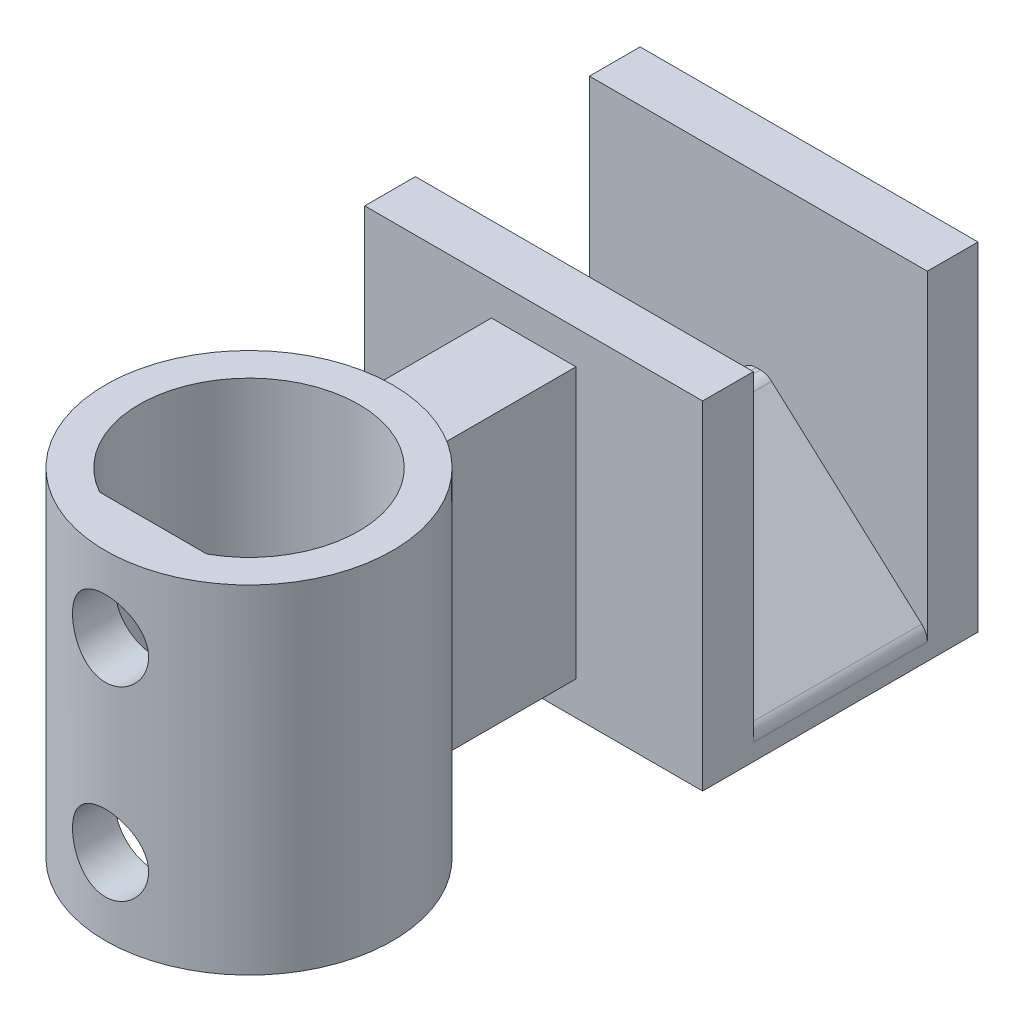
ISO-10303-21;
HEADER;
FILE_DESCRIPTION(('STEP AP214'),'2;1');
FILE_NAME('part.step','',(''),(''),'','','');
FILE_SCHEMA(('AUTOMOTIVE_DESIGN { 1 0 10303 214 1 1 1 1 }'));
ENDSEC;
DATA;
#1=APPLICATION_CONTEXT('core data for automotive mechanical design processes');
#2=APPLICATION_PROTOCOL_DEFINITION('international standard','automotive_design',2000,#1);
#3=PRODUCT_CONTEXT('',#1,'mechanical');
#4=PRODUCT('Part','Part','',(#3));
#5=PRODUCT_RELATED_PRODUCT_CATEGORY('part','',(#4));
#6=PRODUCT_DEFINITION_FORMATION('','',#4);
#7=PRODUCT_DEFINITION_CONTEXT('part definition',#1,'design');
#8=PRODUCT_DEFINITION('design','',#6,#7);
#9=PRODUCT_DEFINITION_SHAPE('','',#8);
#10=(LENGTH_UNIT() NAMED_UNIT(*) SI_UNIT(.MILLI.,.METRE.));
#11=(NAMED_UNIT(*) PLANE_ANGLE_UNIT() SI_UNIT($,.RADIAN.));
#12=(NAMED_UNIT(*) SI_UNIT($,.STERADIAN.) SOLID_ANGLE_UNIT());
#13=UNCERTAINTY_MEASURE_WITH_UNIT(LENGTH_MEASURE(1.E-05),#10,'distance_accuracy_value','');
#14=(GEOMETRIC_REPRESENTATION_CONTEXT(3) GLOBAL_UNCERTAINTY_ASSIGNED_CONTEXT((#13)) GLOBAL_UNIT_ASSIGNED_CONTEXT((#10,
#11,#12)) REPRESENTATION_CONTEXT('',''));
#15=CARTESIAN_POINT('',(0.,0.,0.));
#16=DIRECTION('',(0.,0.,1.));
#17=DIRECTION('',(1.,0.,0.));
#18=AXIS2_PLACEMENT_3D('',#15,#16,#17);
#19=CARTESIAN_POINT('',(0.,39.0416305603426,25.));
#20=DIRECTION('',(0.,-1.,0.));
#21=DIRECTION('',(0.,0.,-1.));
#22=AXIS2_PLACEMENT_3D('',#19,#20,#21);
#23=CYLINDRICAL_SURFACE('',#22,8.5);
#24=CARTESIAN_POINT('',(0.,15.,25.));
#25=DIRECTION('',(0.,-1.,0.));
#26=DIRECTION('',(0.,0.,-1.));
#27=AXIS2_PLACEMENT_3D('',#24,#25,#26);
#28=CIRCLE('',#27,8.5);
#29=CARTESIAN_POINT('',(0.,15.,16.5));
#30=VERTEX_POINT('',#29);
#31=EDGE_CURVE('E186',#30,#30,#28,.T.);
#32=ORIENTED_EDGE('',*,*,#31,.T.);
#33=EDGE_LOOP('',(#32));
#34=FACE_BOUND('',#33,.T.);
#35=CARTESIAN_POINT('',(0.,-5.,25.));
#36=DIRECTION('',(0.,1.,0.));
#37=DIRECTION('',(0.,0.,1.));
#38=AXIS2_PLACEMENT_3D('',#35,#36,#37);
#39=CIRCLE('',#38,8.5);
#40=CARTESIAN_POINT('',(0.,-5.,33.5));
#41=VERTEX_POINT('',#40);
#42=EDGE_CURVE('E192',#41,#41,#39,.F.);
#43=ORIENTED_EDGE('',*,*,#42,.F.);
#44=EDGE_LOOP('',(#43));
#45=FACE_BOUND('',#44,.T.);
#46=CARTESIAN_POINT('',(0.,-3.,25.));
#47=DIRECTION('',(0.,1.,0.));
#48=DIRECTION('',(0.,0.,1.));
#49=AXIS2_PLACEMENT_3D('',#46,#47,#48);
#50=CIRCLE('',#49,8.5);
#51=CARTESIAN_POINT('',(-2.5,-3.,16.875961595364));
#52=VERTEX_POINT('',#51);
#53=CARTESIAN_POINT('',(2.5,-3.,16.875961595364));
#54=VERTEX_POINT('',#53);
#55=EDGE_CURVE('E226',#52,#54,#50,.F.);
#56=ORIENTED_EDGE('',*,*,#55,.T.);
#57=DIRECTION('',(0.,-1.,0.));
#58=VECTOR('',#57,1.);
#59=CARTESIAN_POINT('',(2.49999999999999,39.0416305603426,16.875961595364));
#60=LINE('',#59,#58);
#61=CARTESIAN_POINT('',(2.5,13.,16.875961595364));
#62=VERTEX_POINT('',#61);
#63=EDGE_CURVE('E211',#54,#62,#60,.F.);
#64=ORIENTED_EDGE('',*,*,#63,.T.);
#65=CARTESIAN_POINT('',(0.,13.,25.));
#66=DIRECTION('',(0.,-1.,0.));
#67=DIRECTION('',(0.,0.,-1.));
#68=AXIS2_PLACEMENT_3D('',#65,#66,#67);
#69=CIRCLE('',#68,8.5);
#70=CARTESIAN_POINT('',(-2.5,13.,16.875961595364));
#71=VERTEX_POINT('',#70);
#72=EDGE_CURVE('E233',#62,#71,#69,.F.);
#73=ORIENTED_EDGE('',*,*,#72,.T.);
#74=DIRECTION('',(0.,-1.,0.));
#75=VECTOR('',#74,1.);
#76=CARTESIAN_POINT('',(-2.5,39.0416305603426,16.875961595364));
#77=LINE('',#76,#75);
#78=EDGE_CURVE('E230',#71,#52,#77,.T.);
#79=ORIENTED_EDGE('',*,*,#78,.T.);
#80=EDGE_LOOP('',(#56,#64,#73,#79));
#81=FACE_BOUND('',#80,.T.);
#82=CARTESIAN_POINT('',(-2.25,10.5,33.1967981553775));
#83=CARTESIAN_POINT('',(-2.24999694180408,10.6239840002776,33.1968003362435));
#84=CARTESIAN_POINT('',(-2.23971706610501,10.7480005412109,33.1996419584915));
#85=CARTESIAN_POINT('',(-2.198945615888,10.9924544608563,33.2106680196964));
#86=CARTESIAN_POINT('',(-2.16844370713168,11.112889976629,33.2188551904021));
#87=CARTESIAN_POINT('',(-2.0882990785985,11.3466102401079,33.2395815791112));
#88=CARTESIAN_POINT('',(-2.03868300476042,11.459904688051,33.2521147362105));
#89=CARTESIAN_POINT('',(-1.92180166354043,11.6765786826062,33.2801132198881));
#90=CARTESIAN_POINT('',(-1.85453509902009,11.7799574997535,33.2955787619447));
#91=CARTESIAN_POINT('',(-1.70248951742595,11.9764139017784,33.3281265446091));
#92=CARTESIAN_POINT('',(-1.61735395744878,12.0692109081865,33.3452371126252));
#93=CARTESIAN_POINT('',(-1.4327540142738,12.2393902103004,33.3789023677977));
#94=CARTESIAN_POINT('',(-1.33328816547564,12.3167709274061,33.3954569978831));
#95=CARTESIAN_POINT('',(-1.12090838569079,12.4550884366435,33.4264608929721));
#96=CARTESIAN_POINT('',(-1.00780712819347,12.5157466883929,33.4408728427373));
#97=CARTESIAN_POINT('',(-0.772566710508234,12.6170815196129,33.4656427357432));
#98=CARTESIAN_POINT('',(-0.650429055025734,12.6577614172222,33.4760013521304));
#99=CARTESIAN_POINT('',(-0.403511110172187,12.7170778425828,33.4912971460741));
#100=CARTESIAN_POINT('',(-0.278852839843893,12.7361915561904,33.4963515042717));
#101=CARTESIAN_POINT('',(-0.0280034780646866,12.7533339423421,33.5008788349257));
#102=CARTESIAN_POINT('',(0.0981873570184365,12.7513660941808,33.5003527283806));
#103=CARTESIAN_POINT('',(0.34519977639906,12.7267381177659,33.4938644304373));
#104=CARTESIAN_POINT('',(0.466076857336715,12.7045934898765,33.4880376721779));
#105=CARTESIAN_POINT('',(0.702334013138001,12.6410728615727,33.4717623278363));
#106=CARTESIAN_POINT('',(0.817713776487286,12.5996957727456,33.4613134801802));
#107=CARTESIAN_POINT('',(1.04102215095086,12.4984870248307,33.4367663576623));
#108=CARTESIAN_POINT('',(1.14886634833951,12.4384779194592,33.4226332115479));
#109=CARTESIAN_POINT('',(1.3531303740591,12.301844580475,33.3922415251126));
#110=CARTESIAN_POINT('',(1.44954799839656,12.2252171495074,33.375982576028));
#111=CARTESIAN_POINT('',(1.63129857081783,12.0547825542084,33.342521924539));
#112=CARTESIAN_POINT('',(1.71620777876131,11.9605256731685,33.3253065822884));
#113=CARTESIAN_POINT('',(1.86911637013184,11.7589321307718,33.2923181202052));
#114=CARTESIAN_POINT('',(1.93711475347608,11.6515946964081,33.2765450857034));
#115=CARTESIAN_POINT('',(2.05458778503724,11.4259787352489,33.2481731019722));
#116=CARTESIAN_POINT('',(2.10394886477225,11.3076384369629,33.2355937612802));
#117=CARTESIAN_POINT('',(2.18193716023719,11.0639230764637,33.2152779792318));
#118=CARTESIAN_POINT('',(2.21056943128527,10.9385497375025,33.207540357145));
#119=CARTESIAN_POINT('',(2.24556016825425,10.6882860893502,33.1980351929453));
#120=CARTESIAN_POINT('',(2.25255005779307,10.5634903897575,33.1960984643835));
#121=CARTESIAN_POINT('',(2.24579596911986,10.3145136151024,33.1979517680045));
#122=CARTESIAN_POINT('',(2.23205416085442,10.19033247708,33.2017412008412));
#123=CARTESIAN_POINT('',(2.18478304951454,9.94853203437677,33.2144565867633));
#124=CARTESIAN_POINT('',(2.15163187005439,9.83083314067768,33.2232843058655));
#125=CARTESIAN_POINT('',(2.06690749717098,9.60266578735862,33.2449859622244));
#126=CARTESIAN_POINT('',(2.0153319242454,9.49219826384843,33.2578604220901));
#127=CARTESIAN_POINT('',(1.89393612864426,9.27898360406455,33.2865532711528));
#128=CARTESIAN_POINT('',(1.82374430356199,9.17645600255329,33.3024294781708));
#129=CARTESIAN_POINT('',(1.66757023068808,8.98440278488017,33.3352002454647));
#130=CARTESIAN_POINT('',(1.58158505971235,8.89487958119961,33.3520949938724));
#131=CARTESIAN_POINT('',(1.39334723217788,8.72876291555247,33.3855805923336));
#132=CARTESIAN_POINT('',(1.29070161878611,8.65260935870141,33.4021491503459));
#133=CARTESIAN_POINT('',(1.07371678547403,8.51861464758931,33.4326221761272));
#134=CARTESIAN_POINT('',(0.959378187911347,8.46077251937521,33.4465267855714));
#135=CARTESIAN_POINT('',(0.723057226149525,8.36557056201773,33.470015772103));
#136=CARTESIAN_POINT('',(0.60113959611423,8.32805833034544,33.4796321961789));
#137=CARTESIAN_POINT('',(0.352439036803731,8.2741367860407,33.4936022569498));
#138=CARTESIAN_POINT('',(0.225657174963255,8.25772287044393,33.4979570415506));
#139=CARTESIAN_POINT('',(-0.0250604722587875,8.24674873433714,33.5008598374346));
#140=CARTESIAN_POINT('',(-0.148966409472797,8.2515427679478,33.499579436696));
#141=CARTESIAN_POINT('',(-0.394141954180563,8.28135153536109,33.4917428575153));
#142=CARTESIAN_POINT('',(-0.515411657917084,8.30636552970252,33.4851868720061));
#143=CARTESIAN_POINT('',(-0.751107699159933,8.37554121781611,33.4675689262979));
#144=CARTESIAN_POINT('',(-0.865574416324465,8.41957360028427,33.4565374265752));
#145=CARTESIAN_POINT('',(-1.08556048681217,8.5254205314973,33.4311229382255));
#146=CARTESIAN_POINT('',(-1.19107859706731,8.58723754551755,33.4167394850088));
#147=CARTESIAN_POINT('',(-1.39318530515942,8.72879850578497,33.3856885458129));
#148=CARTESIAN_POINT('',(-1.48946543719377,8.80897181418192,33.3689708718519));
#149=CARTESIAN_POINT('',(-1.66742398064291,8.98415288335479,33.3353414220771));
#150=CARTESIAN_POINT('',(-1.74909856114583,9.07916452389294,33.3184295965731));
#151=CARTESIAN_POINT('',(-1.8972708258445,9.2837921479421,33.285906991571));
#152=CARTESIAN_POINT('',(-1.96340296292341,9.39367904330234,33.2703321637851));
#153=CARTESIAN_POINT('',(-2.07615948784757,9.62341015894324,33.2427515934587));
#154=CARTESIAN_POINT('',(-2.12279681152532,9.74324771294936,33.2307434857482));
#155=CARTESIAN_POINT('',(-2.18903256232817,9.96889360228065,33.2133487458215));
#156=CARTESIAN_POINT('',(-2.21184214669942,10.0737109686333,33.2071920574266));
#157=CARTESIAN_POINT('',(-2.24232635318084,10.2856776239988,33.1989160421293));
#158=CARTESIAN_POINT('',(-2.25000264354342,10.3928266546586,33.1967962702092));
#159=CARTESIAN_POINT('',(-2.25,10.5,33.1967981553775));
#160=B_SPLINE_CURVE_WITH_KNOTS('',3,(#82,#83,#84,#85,#86,#87,#88,#89,#90,#91,#92,#93,#94,#95,
#96,#97,#98,#99,#100,#101,#102,#103,#104,#105,#106,#107,#108,#109,#110,#111,#112,#113,#114,#115,
#116,#117,#118,#119,#120,#121,#122,#123,#124,#125,#126,#127,#128,#129,#130,#131,#132,#133,#134,
#135,#136,#137,#138,#139,#140,#141,#142,#143,#144,#145,#146,#147,#148,#149,#150,#151,#152,#153,
#154,#155,#156,#157,#158,#159),.UNSPECIFIED.,.T.,.F.,(4,2,2,2,2,2,2,2,2,2,2,2,2,2,2,2,2,2,2,2,2,
2,2,2,2,2,2,2,2,2,2,2,2,2,2,2,2,2,4),(0.,0.37155797163531,0.743305970231715,1.11453760110695,
1.48579652152091,1.86532086241599,2.24488404596034,2.63043245150024,3.01591680090743,
3.39269333716487,3.76940769129443,4.13675920765004,4.50413151587257,4.87511584526133,
5.24617161521628,5.62845622010334,6.01076342740043,6.3953640456007,6.77987083621654,
7.15304843134813,7.52618696941451,7.89228731518204,8.25843495975225,8.63252754907452,
9.00668944894658,9.39148781847044,9.77626571779774,10.1581177737158,10.539886507824,
10.9101123860205,11.2803247253535,11.6480585642679,12.0158434024024,12.3933170752266,
12.7708896114263,13.156610044578,13.5420741241071,13.8632889681006,14.1844684002793),.UNSPECIFIED.);
#161=CARTESIAN_POINT('',(-2.25,10.5,33.1967981553775));
#162=VERTEX_POINT('',#161);
#163=EDGE_CURVE('E198',#162,#162,#160,.T.);
#164=ORIENTED_EDGE('',*,*,#163,.T.);
#165=EDGE_LOOP('',(#164));
#166=FACE_BOUND('',#165,.T.);
#167=CARTESIAN_POINT('',(-2.25,-0.500000000000002,33.1967981553775));
#168=CARTESIAN_POINT('',(-2.24999694180408,-0.376015999722374,33.1968003362435));
#169=CARTESIAN_POINT('',(-2.23971706610501,-0.251999458789078,33.1996419584915));
#170=CARTESIAN_POINT('',(-2.198945615888,-0.00754553914369019,33.2106680196964));
#171=CARTESIAN_POINT('',(-2.16844370713168,0.112889976628972,33.2188551904021));
#172=CARTESIAN_POINT('',(-2.0882990785985,0.346610240107896,33.2395815791112));
#173=CARTESIAN_POINT('',(-2.03868300476042,0.459904688051024,33.2521147362105));
#174=CARTESIAN_POINT('',(-1.92180166354043,0.676578682606188,33.2801132198881));
#175=CARTESIAN_POINT('',(-1.85453509902009,0.779957499753548,33.2955787619447));
#176=CARTESIAN_POINT('',(-1.70248951742595,0.976413901778359,33.3281265446091));
#177=CARTESIAN_POINT('',(-1.61735395744878,1.06921090818649,33.3452371126252));
#178=CARTESIAN_POINT('',(-1.4327540142738,1.23939021030035,33.3789023677977));
#179=CARTESIAN_POINT('',(-1.33328816547564,1.31677092740614,33.3954569978831));
#180=CARTESIAN_POINT('',(-1.12090838569079,1.45508843664353,33.426460892972));
#181=CARTESIAN_POINT('',(-1.00780712819347,1.51574668839292,33.4408728427372));
#182=CARTESIAN_POINT('',(-0.772566710508234,1.6170815196129,33.4656427357431));
#183=CARTESIAN_POINT('',(-0.650429055025735,1.65776141722221,33.4760013521304));
#184=CARTESIAN_POINT('',(-0.403511110172187,1.71707784258281,33.4912971460741));
#185=CARTESIAN_POINT('',(-0.278852839843893,1.73619155619042,33.4963515042717));
#186=CARTESIAN_POINT('',(-0.0280034780646869,1.75333394234214,33.5008788349257));
#187=CARTESIAN_POINT('',(0.0981873570184361,1.75136609418084,33.5003527283806));
#188=CARTESIAN_POINT('',(0.34519977639906,1.72673811776592,33.4938644304373));
#189=CARTESIAN_POINT('',(0.466076857336715,1.70459348987647,33.4880376721779));
#190=CARTESIAN_POINT('',(0.702334013138001,1.6410728615727,33.4717623278363));
#191=CARTESIAN_POINT('',(0.817713776487285,1.59969577274563,33.4613134801802));
#192=CARTESIAN_POINT('',(1.04102215095086,1.49848702483075,33.4367663576623));
#193=CARTESIAN_POINT('',(1.14886634833951,1.43847791945919,33.4226332115479));
#194=CARTESIAN_POINT('',(1.3531303740591,1.30184458047502,33.3922415251126));
#195=CARTESIAN_POINT('',(1.44954799839656,1.22521714950741,33.375982576028));
#196=CARTESIAN_POINT('',(1.63129857081783,1.05478255420836,33.342521924539));
#197=CARTESIAN_POINT('',(1.71620777876131,0.960525673168511,33.3253065822884));
#198=CARTESIAN_POINT('',(1.86911637013183,0.758932130771777,33.2923181202052));
#199=CARTESIAN_POINT('',(1.93711475347608,0.651594696408099,33.2765450857034));
#200=CARTESIAN_POINT('',(2.05458778503724,0.425978735248875,33.2481731019722));
#201=CARTESIAN_POINT('',(2.10394886477225,0.307638436962872,33.2355937612802));
#202=CARTESIAN_POINT('',(2.18193716023719,0.0639230764637289,33.2152779792318));
#203=CARTESIAN_POINT('',(2.21056943128527,-0.0614502624975041,33.207540357145));
#204=CARTESIAN_POINT('',(2.24556016825425,-0.311713910649751,33.1980351929453));
#205=CARTESIAN_POINT('',(2.25255005779307,-0.436509610242537,33.1960984643835));
#206=CARTESIAN_POINT('',(2.24579596911986,-0.685486384897617,33.1979517680045));
#207=CARTESIAN_POINT('',(2.23205416085442,-0.809667522920008,33.2017412008412));
#208=CARTESIAN_POINT('',(2.18478304951454,-1.05146796562323,33.2144565867633));
#209=CARTESIAN_POINT('',(2.15163187005439,-1.16916685932232,33.2232843058654));
#210=CARTESIAN_POINT('',(2.06690749717098,-1.39733421264138,33.2449859622244));
#211=CARTESIAN_POINT('',(2.0153319242454,-1.50780173615157,33.2578604220901));
#212=CARTESIAN_POINT('',(1.89393612864426,-1.72101639593545,33.2865532711528));
#213=CARTESIAN_POINT('',(1.82374430356199,-1.82354399744671,33.3024294781708));
#214=CARTESIAN_POINT('',(1.66757023068808,-2.01559721511983,33.3352002454647));
#215=CARTESIAN_POINT('',(1.58158505971235,-2.10512041880039,33.3520949938724));
#216=CARTESIAN_POINT('',(1.39334723217788,-2.27123708444753,33.3855805923336));
#217=CARTESIAN_POINT('',(1.29070161878611,-2.34739064129859,33.4021491503459));
#218=CARTESIAN_POINT('',(1.07371678547403,-2.48138535241069,33.4326221761272));
#219=CARTESIAN_POINT('',(0.959378187911347,-2.53922748062479,33.4465267855714));
#220=CARTESIAN_POINT('',(0.723057226149525,-2.63442943798227,33.470015772103));
#221=CARTESIAN_POINT('',(0.60113959611423,-2.67194166965456,33.4796321961789));
#222=CARTESIAN_POINT('',(0.352439036803731,-2.7258632139593,33.4936022569498));
#223=CARTESIAN_POINT('',(0.225657174963256,-2.74227712955607,33.4979570415506));
#224=CARTESIAN_POINT('',(-0.0250604722587871,-2.75325126566286,33.5008598374346));
#225=CARTESIAN_POINT('',(-0.148966409472797,-2.7484572320522,33.499579436696));
#226=CARTESIAN_POINT('',(-0.394141954180563,-2.71864846463891,33.4917428575153));
#227=CARTESIAN_POINT('',(-0.515411657917083,-2.69363447029748,33.4851868720061));
#228=CARTESIAN_POINT('',(-0.751107699159933,-2.62445878218389,33.4675689262979));
#229=CARTESIAN_POINT('',(-0.865574416324465,-2.58042639971573,33.4565374265752));
#230=CARTESIAN_POINT('',(-1.08556048681217,-2.4745794685027,33.4311229382255));
#231=CARTESIAN_POINT('',(-1.19107859706731,-2.41276245448245,33.4167394850088));
#232=CARTESIAN_POINT('',(-1.39318530515942,-2.27120149421503,33.3856885458129));
#233=CARTESIAN_POINT('',(-1.48946543719377,-2.19102818581808,33.3689708718519));
#234=CARTESIAN_POINT('',(-1.66742398064291,-2.01584711664521,33.3353414220771));
#235=CARTESIAN_POINT('',(-1.74909856114582,-1.92083547610706,33.3184295965731));
#236=CARTESIAN_POINT('',(-1.8972708258445,-1.7162078520579,33.285906991571));
#237=CARTESIAN_POINT('',(-1.96340296292341,-1.60632095669767,33.2703321637851));
#238=CARTESIAN_POINT('',(-2.07615948784757,-1.37658984105676,33.2427515934587));
#239=CARTESIAN_POINT('',(-2.12279681152532,-1.25675228705065,33.2307434857482));
#240=CARTESIAN_POINT('',(-2.18903256232817,-1.03110639771935,33.2133487458215));
#241=CARTESIAN_POINT('',(-2.21184214669942,-0.92628903136672,33.2071920574266));
#242=CARTESIAN_POINT('',(-2.24232635318084,-0.714322376001232,33.1989160421293));
#243=CARTESIAN_POINT('',(-2.25000264354342,-0.607173345341352,33.1967962702092));
#244=CARTESIAN_POINT('',(-2.25,-0.500000000000002,33.1967981553775));
#245=B_SPLINE_CURVE_WITH_KNOTS('',3,(#167,#168,#169,#170,#171,#172,#173,#174,#175,#176,#177,
#178,#179,#180,#181,#182,#183,#184,#185,#186,#187,#188,#189,#190,#191,#192,#193,#194,#195,#196,
#197,#198,#199,#200,#201,#202,#203,#204,#205,#206,#207,#208,#209,#210,#211,#212,#213,#214,#215,
#216,#217,#218,#219,#220,#221,#222,#223,#224,#225,#226,#227,#228,#229,#230,#231,#232,#233,#234,
#235,#236,#237,#238,#239,#240,#241,#242,#243,#244),.UNSPECIFIED.,.T.,.F.,(4,2,2,2,2,2,2,2,2,2,2,
2,2,2,2,2,2,2,2,2,2,2,2,2,2,2,2,2,2,2,2,2,2,2,2,2,2,2,4),(0.,0.371557971635309,
0.743305970231715,1.11453760110695,1.48579652152091,1.86532086241599,2.24488404596033,
2.63043245150024,3.01591680090743,3.39269333716487,3.76940769129443,4.13675920765004,
4.50413151587256,4.87511584526133,5.24617161521628,5.62845622010334,6.01076342740043,
6.3953640456007,6.77987083621654,7.15304843134812,7.5261869694145,7.89228731518204,
8.25843495975225,8.63252754907452,9.00668944894658,9.39148781847044,9.77626571779773,
10.1581177737158,10.539886507824,10.9101123860205,11.2803247253535,11.6480585642679,
12.0158434024024,12.3933170752266,12.7708896114263,13.156610044578,13.5420741241071,
13.8632889681006,14.1844684002793),.UNSPECIFIED.);
#246=CARTESIAN_POINT('',(-2.25,-0.500000000000002,33.1967981553775));
#247=VERTEX_POINT('',#246);
#248=EDGE_CURVE('E616',#247,#247,#245,.T.);
#249=ORIENTED_EDGE('',*,*,#248,.T.);
#250=EDGE_LOOP('',(#249));
#251=FACE_BOUND('',#250,.T.);
#252=ADVANCED_FACE('F35',(#34,#45,#81,#166,#251),#23,.T.);
#253=CARTESIAN_POINT('',(0.,0.,8.15));
#254=DIRECTION('',(0.,0.,1.));
#255=DIRECTION('',(1.,0.,0.));
#256=AXIS2_PLACEMENT_3D('',#253,#254,#255);
#257=PLANE('',#256);
#258=DIRECTION('',(0.,1.,0.));
#259=VECTOR('',#258,1.);
#260=CARTESIAN_POINT('',(10.,15.,8.15));
#261=LINE('',#260,#259);
#262=CARTESIAN_POINT('',(10.,-5.,8.15));
#263=VERTEX_POINT('',#262);
#264=CARTESIAN_POINT('',(10.,15.,8.15));
#265=VERTEX_POINT('',#264);
#266=EDGE_CURVE('E263',#263,#265,#261,.T.);
#267=ORIENTED_EDGE('',*,*,#266,.T.);
#268=DIRECTION('',(-1.,0.,0.));
#269=VECTOR('',#268,1.);
#270=CARTESIAN_POINT('',(-10.,15.,8.15));
#271=LINE('',#270,#269);
#272=CARTESIAN_POINT('',(-10.,15.,8.15));
#273=VERTEX_POINT('',#272);
#274=EDGE_CURVE('E266',#265,#273,#271,.T.);
#275=ORIENTED_EDGE('',*,*,#274,.T.);
#276=DIRECTION('',(0.,-1.,0.));
#277=VECTOR('',#276,1.);
#278=CARTESIAN_POINT('',(-10.,15.,8.15));
#279=LINE('',#278,#277);
#280=CARTESIAN_POINT('',(-10.,-5.,8.15));
#281=VERTEX_POINT('',#280);
#282=EDGE_CURVE('E269',#273,#281,#279,.T.);
#283=ORIENTED_EDGE('',*,*,#282,.T.);
#284=DIRECTION('',(1.,0.,0.));
#285=VECTOR('',#284,1.);
#286=CARTESIAN_POINT('',(-10.,-5.,8.15));
#287=LINE('',#286,#285);
#288=EDGE_CURVE('E272',#281,#263,#287,.T.);
#289=ORIENTED_EDGE('',*,*,#288,.T.);
#290=EDGE_LOOP('',(#267,#275,#283,#289));
#291=FACE_BOUND('',#290,.T.);
#292=DIRECTION('',(-1.,0.,0.));
#293=VECTOR('',#292,1.);
#294=CARTESIAN_POINT('',(-2.5,13.,8.15));
#295=LINE('',#294,#293);
#296=CARTESIAN_POINT('',(2.5,13.,8.15));
#297=VERTEX_POINT('',#296);
#298=CARTESIAN_POINT('',(-2.5,13.,8.15));
#299=VERTEX_POINT('',#298);
#300=EDGE_CURVE('E215',#297,#299,#295,.T.);
#301=ORIENTED_EDGE('',*,*,#300,.F.);
#302=DIRECTION('',(0.,1.,0.));
#303=VECTOR('',#302,1.);
#304=CARTESIAN_POINT('',(2.5,13.,8.15));
#305=LINE('',#304,#303);
#306=CARTESIAN_POINT('',(2.5,-3.,8.15));
#307=VERTEX_POINT('',#306);
#308=EDGE_CURVE('E219',#307,#297,#305,.T.);
#309=ORIENTED_EDGE('',*,*,#308,.F.);
#310=DIRECTION('',(1.,0.,0.));
#311=VECTOR('',#310,1.);
#312=CARTESIAN_POINT('',(-2.5,-3.,8.15));
#313=LINE('',#312,#311);
#314=CARTESIAN_POINT('',(-2.5,-3.,8.15));
#315=VERTEX_POINT('',#314);
#316=EDGE_CURVE('E208',#315,#307,#313,.T.);
#317=ORIENTED_EDGE('',*,*,#316,.F.);
#318=DIRECTION('',(0.,-1.,0.));
#319=VECTOR('',#318,1.);
#320=CARTESIAN_POINT('',(-2.5,13.,8.15));
#321=LINE('',#320,#319);
#322=EDGE_CURVE('E52',#299,#315,#321,.T.);
#323=ORIENTED_EDGE('',*,*,#322,.F.);
#324=EDGE_LOOP('',(#301,#309,#317,#323));
#325=FACE_BOUND('',#324,.T.);
#326=ADVANCED_FACE('F396',(#291,#325),#257,.T.);
#327=CARTESIAN_POINT('',(10.,-5.,5.15));
#328=DIRECTION('',(-1.,0.,0.));
#329=DIRECTION('',(0.,0.,1.));
#330=AXIS2_PLACEMENT_3D('',#327,#328,#329);
#331=PLANE('',#330);
#332=DIRECTION('',(0.,0.,-1.));
#333=VECTOR('',#332,1.);
#334=CARTESIAN_POINT('',(10.,-5.,5.15));
#335=LINE('',#334,#333);
#336=CARTESIAN_POINT('',(10.,-5.,-8.15));
#337=VERTEX_POINT('',#336);
#338=EDGE_CURVE('E290',#263,#337,#335,.T.);
#339=ORIENTED_EDGE('',*,*,#338,.T.);
#340=DIRECTION('',(0.,1.,0.));
#341=VECTOR('',#340,1.);
#342=CARTESIAN_POINT('',(10.,15.,-8.15));
#343=LINE('',#342,#341);
#344=CARTESIAN_POINT('',(10.,15.,-8.15));
#345=VERTEX_POINT('',#344);
#346=EDGE_CURVE('E238',#337,#345,#343,.T.);
#347=ORIENTED_EDGE('',*,*,#346,.T.);
#348=DIRECTION('',(0.,0.,1.));
#349=VECTOR('',#348,1.);
#350=CARTESIAN_POINT('',(10.,15.,-8.15));
#351=LINE('',#350,#349);
#352=CARTESIAN_POINT('',(10.,15.,-5.15));
#353=VERTEX_POINT('',#352);
#354=EDGE_CURVE('E251',#345,#353,#351,.T.);
#355=ORIENTED_EDGE('',*,*,#354,.T.);
#356=DIRECTION('',(0.,1.,0.));
#357=VECTOR('',#356,1.);
#358=CARTESIAN_POINT('',(10.,15.,-5.15));
#359=LINE('',#358,#357);
#360=CARTESIAN_POINT('',(10.,-3.99906710613801,-5.15));
#361=VERTEX_POINT('',#360);
#362=EDGE_CURVE('E229',#361,#353,#359,.T.);
#363=ORIENTED_EDGE('',*,*,#362,.F.);
#364=DIRECTION('',(0.,0.,-1.));
#365=VECTOR('',#364,1.);
#366=CARTESIAN_POINT('',(10.,-3.99906710613801,5.15));
#367=LINE('',#366,#365);
#368=CARTESIAN_POINT('',(10.,-3.99906710613801,5.15));
#369=VERTEX_POINT('',#368);
#370=EDGE_CURVE('E336',#361,#369,#367,.F.);
#371=ORIENTED_EDGE('',*,*,#370,.T.);
#372=DIRECTION('',(0.,1.,0.));
#373=VECTOR('',#372,1.);
#374=CARTESIAN_POINT('',(10.,15.,5.15));
#375=LINE('',#374,#373);
#376=CARTESIAN_POINT('',(10.,15.,5.15));
#377=VERTEX_POINT('',#376);
#378=EDGE_CURVE('E262',#369,#377,#375,.T.);
#379=ORIENTED_EDGE('',*,*,#378,.T.);
#380=DIRECTION('',(0.,0.,-1.));
#381=VECTOR('',#380,1.);
#382=CARTESIAN_POINT('',(10.,15.,8.15));
#383=LINE('',#382,#381);
#384=EDGE_CURVE('E283',#265,#377,#383,.T.);
#385=ORIENTED_EDGE('',*,*,#384,.F.);
#386=ORIENTED_EDGE('',*,*,#266,.F.);
#387=EDGE_LOOP('',(#339,#347,#355,#363,#371,#379,#385,#386));
#388=FACE_BOUND('',#387,.T.);
#389=ADVANCED_FACE('F374',(#388),#331,.F.);
#390=CARTESIAN_POINT('',(-10.,5.,5.15));
#391=DIRECTION('',(0.,-1.,0.));
#392=DIRECTION('',(0.,0.,-1.));
#393=AXIS2_PLACEMENT_3D('',#390,#391,#392);
#394=PLANE('',#393);
#395=DIRECTION('',(-1.,0.,0.));
#396=VECTOR('',#395,1.);
#397=CARTESIAN_POINT('',(-10.,5.,5.15));
#398=LINE('',#397,#396);
#399=CARTESIAN_POINT('',(0.116135964964556,5.,5.15));
#400=VERTEX_POINT('',#399);
#401=CARTESIAN_POINT('',(-0.116135964964553,5.,5.15));
#402=VERTEX_POINT('',#401);
#403=EDGE_CURVE('E287',#400,#402,#398,.T.);
#404=ORIENTED_EDGE('',*,*,#403,.F.);
#405=DIRECTION('',(0.,0.,1.));
#406=VECTOR('',#405,1.);
#407=CARTESIAN_POINT('',(0.116135964964556,5.,-5.15));
#408=LINE('',#407,#406);
#409=CARTESIAN_POINT('',(0.116135964964556,5.,-5.15));
#410=VERTEX_POINT('',#409);
#411=EDGE_CURVE('E11',#400,#410,#408,.F.);
#412=ORIENTED_EDGE('',*,*,#411,.T.);
#413=DIRECTION('',(-1.,0.,0.));
#414=VECTOR('',#413,1.);
#415=CARTESIAN_POINT('',(-10.,5.,-5.15));
#416=LINE('',#415,#414);
#417=CARTESIAN_POINT('',(-0.116135964964553,5.,-5.15));
#418=VERTEX_POINT('',#417);
#419=EDGE_CURVE('E286',#410,#418,#416,.T.);
#420=ORIENTED_EDGE('',*,*,#419,.T.);
#421=DIRECTION('',(0.,0.,-1.));
#422=VECTOR('',#421,1.);
#423=CARTESIAN_POINT('',(-0.116135964964553,5.,5.15));
#424=LINE('',#423,#422);
#425=EDGE_CURVE('E44',#418,#402,#424,.F.);
#426=ORIENTED_EDGE('',*,*,#425,.T.);
#427=EDGE_LOOP('',(#404,#412,#420,#426));
#428=FACE_BOUND('',#427,.T.);
#429=ADVANCED_FACE('F344',(#428),#394,.F.);
#430=CARTESIAN_POINT('',(-10.,-5.,5.15));
#431=DIRECTION('',(1.,0.,0.));
#432=DIRECTION('',(0.,0.,-1.));
#433=AXIS2_PLACEMENT_3D('',#430,#431,#432);
#434=PLANE('',#433);
#435=DIRECTION('',(0.,0.,-1.));
#436=VECTOR('',#435,1.);
#437=CARTESIAN_POINT('',(-10.,-5.,5.15));
#438=LINE('',#437,#436);
#439=CARTESIAN_POINT('',(-10.,-5.,-8.15));
#440=VERTEX_POINT('',#439);
#441=EDGE_CURVE('E293',#281,#440,#438,.T.);
#442=ORIENTED_EDGE('',*,*,#441,.F.);
#443=ORIENTED_EDGE('',*,*,#282,.F.);
#444=DIRECTION('',(0.,0.,-1.));
#445=VECTOR('',#444,1.);
#446=CARTESIAN_POINT('',(-10.,15.,8.15));
#447=LINE('',#446,#445);
#448=CARTESIAN_POINT('',(-10.,15.,5.15));
#449=VERTEX_POINT('',#448);
#450=EDGE_CURVE('E275',#273,#449,#447,.T.);
#451=ORIENTED_EDGE('',*,*,#450,.T.);
#452=DIRECTION('',(0.,-1.,0.));
#453=VECTOR('',#452,1.);
#454=CARTESIAN_POINT('',(-10.,15.,5.15));
#455=LINE('',#454,#453);
#456=CARTESIAN_POINT('',(-10.,-3.99906710613801,5.15));
#457=VERTEX_POINT('',#456);
#458=EDGE_CURVE('E267',#449,#457,#455,.T.);
#459=ORIENTED_EDGE('',*,*,#458,.T.);
#460=DIRECTION('',(0.,0.,1.));
#461=VECTOR('',#460,1.);
#462=CARTESIAN_POINT('',(-10.,-3.99906710613801,-5.15));
#463=LINE('',#462,#461);
#464=CARTESIAN_POINT('',(-10.,-3.99906710613801,-5.15));
#465=VERTEX_POINT('',#464);
#466=EDGE_CURVE('E307',#457,#465,#463,.F.);
#467=ORIENTED_EDGE('',*,*,#466,.T.);
#468=DIRECTION('',(0.,-1.,0.));
#469=VECTOR('',#468,1.);
#470=CARTESIAN_POINT('',(-10.,15.,-5.15));
#471=LINE('',#470,#469);
#472=CARTESIAN_POINT('',(-10.,15.,-5.15));
#473=VERTEX_POINT('',#472);
#474=EDGE_CURVE('E253',#473,#465,#471,.T.);
#475=ORIENTED_EDGE('',*,*,#474,.F.);
#476=DIRECTION('',(0.,0.,1.));
#477=VECTOR('',#476,1.);
#478=CARTESIAN_POINT('',(-10.,15.,-8.15));
#479=LINE('',#478,#477);
#480=CARTESIAN_POINT('',(-10.,15.,-8.15));
#481=VERTEX_POINT('',#480);
#482=EDGE_CURVE('E260',#481,#473,#479,.T.);
#483=ORIENTED_EDGE('',*,*,#482,.F.);
#484=DIRECTION('',(0.,-1.,0.));
#485=VECTOR('',#484,1.);
#486=CARTESIAN_POINT('',(-10.,15.,-8.15));
#487=LINE('',#486,#485);
#488=EDGE_CURVE('E245',#481,#440,#487,.T.);
#489=ORIENTED_EDGE('',*,*,#488,.T.);
#490=EDGE_LOOP('',(#442,#443,#451,#459,#467,#475,#483,#489));
#491=FACE_BOUND('',#490,.T.);
#492=ADVANCED_FACE('F365',(#491),#434,.F.);
#493=CARTESIAN_POINT('',(-10.,-5.,5.15));
#494=DIRECTION('',(0.,1.,0.));
#495=DIRECTION('',(0.,0.,1.));
#496=AXIS2_PLACEMENT_3D('',#493,#494,#495);
#497=PLANE('',#496);
#498=ORIENTED_EDGE('',*,*,#441,.T.);
#499=DIRECTION('',(1.,0.,0.));
#500=VECTOR('',#499,1.);
#501=CARTESIAN_POINT('',(-10.,-5.,-8.15));
#502=LINE('',#501,#500);
#503=EDGE_CURVE('E241',#440,#337,#502,.T.);
#504=ORIENTED_EDGE('',*,*,#503,.T.);
#505=ORIENTED_EDGE('',*,*,#338,.F.);
#506=ORIENTED_EDGE('',*,*,#288,.F.);
#507=EDGE_LOOP('',(#498,#504,#505,#506));
#508=FACE_BOUND('',#507,.T.);
#509=ADVANCED_FACE('F384',(#508),#497,.F.);
#510=CARTESIAN_POINT('',(0.499999999999971,5.,5.15));
#511=DIRECTION('',(-0.669130606358857,-0.743144825477396,0.));
#512=DIRECTION('',(0.,0.,-1.));
#513=AXIS2_PLACEMENT_3D('',#510,#511,#512);
#514=PLANE('',#513);
#515=DIRECTION('',(0.743144825477396,-0.669130606358857,0.));
#516=VECTOR('',#515,1.);
#517=CARTESIAN_POINT('',(0.499999999999971,5.,5.15));
#518=LINE('',#517,#516);
#519=CARTESIAN_POINT('',(9.66913060635886,-3.25592228066061,5.15));
#520=VERTEX_POINT('',#519);
#521=CARTESIAN_POINT('',(0.785266571323413,4.7431448254774,5.15));
#522=VERTEX_POINT('',#521);
#523=EDGE_CURVE('E304',#520,#522,#518,.F.);
#524=ORIENTED_EDGE('',*,*,#523,.F.);
#525=DIRECTION('',(0.,0.,1.));
#526=VECTOR('',#525,1.);
#527=CARTESIAN_POINT('',(9.66913060635886,-3.25592228066061,-5.15));
#528=LINE('',#527,#526);
#529=CARTESIAN_POINT('',(9.66913060635886,-3.25592228066061,-5.15));
#530=VERTEX_POINT('',#529);
#531=EDGE_CURVE('E341',#520,#530,#528,.F.);
#532=ORIENTED_EDGE('',*,*,#531,.T.);
#533=DIRECTION('',(-0.743144825477396,0.669130606358857,0.));
#534=VECTOR('',#533,1.);
#535=CARTESIAN_POINT('',(2.71017262260376,3.0099516320112,-5.15));
#536=LINE('',#535,#534);
#537=CARTESIAN_POINT('',(0.785266571323413,4.7431448254774,-5.15));
#538=VERTEX_POINT('',#537);
#539=EDGE_CURVE('E298',#538,#530,#536,.F.);
#540=ORIENTED_EDGE('',*,*,#539,.F.);
#541=DIRECTION('',(0.,0.,-1.));
#542=VECTOR('',#541,1.);
#543=CARTESIAN_POINT('',(0.785266571323413,4.7431448254774,5.15));
#544=LINE('',#543,#542);
#545=EDGE_CURVE('E339',#538,#522,#544,.F.);
#546=ORIENTED_EDGE('',*,*,#545,.T.);
#547=EDGE_LOOP('',(#524,#532,#540,#546));
#548=FACE_BOUND('',#547,.T.);
#549=ADVANCED_FACE('F382',(#548),#514,.F.);
#550=CARTESIAN_POINT('',(-10.,-3.55383842082947,5.15));
#551=DIRECTION('',(0.669130606358857,-0.743144825477396,0.));
#552=DIRECTION('',(0.,0.,-1.));
#553=AXIS2_PLACEMENT_3D('',#550,#551,#552);
#554=PLANE('',#553);
#555=DIRECTION('',(-0.743144825477396,-0.669130606358857,0.));
#556=VECTOR('',#555,1.);
#557=CARTESIAN_POINT('',(-2.71017262260375,3.0099516320112,-5.15));
#558=LINE('',#557,#556);
#559=CARTESIAN_POINT('',(-9.66913060635885,-3.25592228066061,-5.15));
#560=VERTEX_POINT('',#559);
#561=CARTESIAN_POINT('',(-0.785266571323409,4.7431448254774,-5.15));
#562=VERTEX_POINT('',#561);
#563=EDGE_CURVE('E295',#560,#562,#558,.F.);
#564=ORIENTED_EDGE('',*,*,#563,.F.);
#565=DIRECTION('',(0.,0.,-1.));
#566=VECTOR('',#565,1.);
#567=CARTESIAN_POINT('',(-9.66913060635885,-3.25592228066061,5.15));
#568=LINE('',#567,#566);
#569=CARTESIAN_POINT('',(-9.66913060635885,-3.25592228066061,5.15));
#570=VERTEX_POINT('',#569);
#571=EDGE_CURVE('E324',#560,#570,#568,.F.);
#572=ORIENTED_EDGE('',*,*,#571,.T.);
#573=DIRECTION('',(0.743144825477396,0.669130606358857,0.));
#574=VECTOR('',#573,1.);
#575=CARTESIAN_POINT('',(-10.,-3.55383842082947,5.15));
#576=LINE('',#575,#574);
#577=CARTESIAN_POINT('',(-0.78526657132341,4.7431448254774,5.15));
#578=VERTEX_POINT('',#577);
#579=EDGE_CURVE('E301',#578,#570,#576,.F.);
#580=ORIENTED_EDGE('',*,*,#579,.F.);
#581=DIRECTION('',(0.,0.,1.));
#582=VECTOR('',#581,1.);
#583=CARTESIAN_POINT('',(-0.785266571323409,4.7431448254774,-5.15));
#584=LINE('',#583,#582);
#585=EDGE_CURVE('E322',#578,#562,#584,.F.);
#586=ORIENTED_EDGE('',*,*,#585,.T.);
#587=EDGE_LOOP('',(#564,#572,#580,#586));
#588=FACE_BOUND('',#587,.T.);
#589=ADVANCED_FACE('F358',(#588),#554,.F.);
#590=CARTESIAN_POINT('',(-9.,-3.99906710613801,5.15));
#591=DIRECTION('',(0.,0.,-1.));
#592=DIRECTION('',(-1.,0.,0.));
#593=AXIS2_PLACEMENT_3D('',#590,#591,#592);
#594=CYLINDRICAL_SURFACE('',#593,1.);
#595=CARTESIAN_POINT('',(-9.,-3.99906710613801,5.15));
#596=DIRECTION('',(0.,0.,-1.));
#597=DIRECTION('',(-1.,0.,0.));
#598=AXIS2_PLACEMENT_3D('',#595,#596,#597);
#599=CIRCLE('',#598,1.);
#600=EDGE_CURVE('E333',#570,#457,#599,.F.);
#601=ORIENTED_EDGE('',*,*,#600,.F.);
#602=ORIENTED_EDGE('',*,*,#571,.F.);
#603=CARTESIAN_POINT('',(-9.,-3.99906710613801,-5.15));
#604=DIRECTION('',(0.,0.,-1.));
#605=DIRECTION('',(-1.,0.,0.));
#606=AXIS2_PLACEMENT_3D('',#603,#604,#605);
#607=CIRCLE('',#606,1.);
#608=EDGE_CURVE('E319',#465,#560,#607,.T.);
#609=ORIENTED_EDGE('',*,*,#608,.F.);
#610=ORIENTED_EDGE('',*,*,#466,.F.);
#611=EDGE_LOOP('',(#601,#602,#609,#610));
#612=FACE_BOUND('',#611,.T.);
#613=ADVANCED_FACE('F390',(#612),#594,.T.);
#614=CARTESIAN_POINT('',(9.00000000000001,-3.99906710613801,5.15));
#615=DIRECTION('',(0.,0.,1.));
#616=DIRECTION('',(1.,0.,0.));
#617=AXIS2_PLACEMENT_3D('',#614,#615,#616);
#618=CYLINDRICAL_SURFACE('',#617,1.);
#619=CARTESIAN_POINT('',(9.00000000000001,-3.99906710613801,-5.15));
#620=DIRECTION('',(0.,0.,-1.));
#621=DIRECTION('',(-1.,0.,0.));
#622=AXIS2_PLACEMENT_3D('',#619,#620,#621);
#623=CIRCLE('',#622,1.);
#624=EDGE_CURVE('E316',#530,#361,#623,.T.);
#625=ORIENTED_EDGE('',*,*,#624,.F.);
#626=ORIENTED_EDGE('',*,*,#531,.F.);
#627=CARTESIAN_POINT('',(9.00000000000001,-3.99906710613801,5.15));
#628=DIRECTION('',(0.,0.,-1.));
#629=DIRECTION('',(-1.,0.,0.));
#630=AXIS2_PLACEMENT_3D('',#627,#628,#629);
#631=CIRCLE('',#630,1.);
#632=EDGE_CURVE('E330',#369,#520,#631,.F.);
#633=ORIENTED_EDGE('',*,*,#632,.F.);
#634=ORIENTED_EDGE('',*,*,#370,.F.);
#635=EDGE_LOOP('',(#625,#626,#633,#634));
#636=FACE_BOUND('',#635,.T.);
#637=ADVANCED_FACE('F379',(#636),#618,.T.);
#638=CARTESIAN_POINT('',(0.116135964964556,4.,5.15));
#639=DIRECTION('',(0.,0.,-1.));
#640=DIRECTION('',(-1.,0.,0.));
#641=AXIS2_PLACEMENT_3D('',#638,#639,#640);
#642=CYLINDRICAL_SURFACE('',#641,1.);
#643=CARTESIAN_POINT('',(0.116135964964556,4.,5.15));
#644=DIRECTION('',(0.,0.,-1.));
#645=DIRECTION('',(-1.,0.,0.));
#646=AXIS2_PLACEMENT_3D('',#643,#644,#645);
#647=CIRCLE('',#646,1.);
#648=EDGE_CURVE('E327',#522,#400,#647,.F.);
#649=ORIENTED_EDGE('',*,*,#648,.F.);
#650=ORIENTED_EDGE('',*,*,#545,.F.);
#651=CARTESIAN_POINT('',(0.116135964964556,4.,-5.15));
#652=DIRECTION('',(0.,0.,-1.));
#653=DIRECTION('',(-1.,0.,0.));
#654=AXIS2_PLACEMENT_3D('',#651,#652,#653);
#655=CIRCLE('',#654,1.);
#656=EDGE_CURVE('E313',#410,#538,#655,.T.);
#657=ORIENTED_EDGE('',*,*,#656,.F.);
#658=ORIENTED_EDGE('',*,*,#411,.F.);
#659=EDGE_LOOP('',(#649,#650,#657,#658));
#660=FACE_BOUND('',#659,.T.);
#661=ADVANCED_FACE('F353',(#660),#642,.T.);
#662=CARTESIAN_POINT('',(-0.116135964964553,4.,5.15));
#663=DIRECTION('',(0.,0.,1.));
#664=DIRECTION('',(1.,0.,0.));
#665=AXIS2_PLACEMENT_3D('',#662,#663,#664);
#666=CYLINDRICAL_SURFACE('',#665,1.);
#667=CARTESIAN_POINT('',(-0.116135964964553,4.,-5.15));
#668=DIRECTION('',(0.,0.,-1.));
#669=DIRECTION('',(-1.,0.,0.));
#670=AXIS2_PLACEMENT_3D('',#667,#668,#669);
#671=CIRCLE('',#670,1.);
#672=EDGE_CURVE('E310',#562,#418,#671,.T.);
#673=ORIENTED_EDGE('',*,*,#672,.F.);
#674=ORIENTED_EDGE('',*,*,#585,.F.);
#675=CARTESIAN_POINT('',(-0.116135964964553,4.,5.15));
#676=DIRECTION('',(0.,0.,-1.));
#677=DIRECTION('',(-1.,0.,0.));
#678=AXIS2_PLACEMENT_3D('',#675,#676,#677);
#679=CIRCLE('',#678,1.);
#680=EDGE_CURVE('E60',#402,#578,#679,.F.);
#681=ORIENTED_EDGE('',*,*,#680,.F.);
#682=ORIENTED_EDGE('',*,*,#425,.F.);
#683=EDGE_LOOP('',(#673,#674,#681,#682));
#684=FACE_BOUND('',#683,.T.);
#685=ADVANCED_FACE('F37',(#684),#666,.T.);
#686=CARTESIAN_POINT('',(-10.,15.,8.15));
#687=DIRECTION('',(0.,-1.,0.));
#688=DIRECTION('',(0.,0.,-1.));
#689=AXIS2_PLACEMENT_3D('',#686,#687,#688);
#690=PLANE('',#689);
#691=DIRECTION('',(-1.,0.,0.));
#692=VECTOR('',#691,1.);
#693=CARTESIAN_POINT('',(-10.,15.,5.15));
#694=LINE('',#693,#692);
#695=EDGE_CURVE('E277',#377,#449,#694,.T.);
#696=ORIENTED_EDGE('',*,*,#695,.T.);
#697=ORIENTED_EDGE('',*,*,#450,.F.);
#698=ORIENTED_EDGE('',*,*,#274,.F.);
#699=ORIENTED_EDGE('',*,*,#384,.T.);
#700=EDGE_LOOP('',(#696,#697,#698,#699));
#701=FACE_BOUND('',#700,.T.);
#702=ADVANCED_FACE('F370',(#701),#690,.F.);
#703=CARTESIAN_POINT('',(0.,0.,5.15));
#704=DIRECTION('',(0.,0.,1.));
#705=DIRECTION('',(1.,0.,0.));
#706=AXIS2_PLACEMENT_3D('',#703,#704,#705);
#707=PLANE('',#706);
#708=ORIENTED_EDGE('',*,*,#579,.T.);
#709=ORIENTED_EDGE('',*,*,#600,.T.);
#710=ORIENTED_EDGE('',*,*,#458,.F.);
#711=ORIENTED_EDGE('',*,*,#695,.F.);
#712=ORIENTED_EDGE('',*,*,#378,.F.);
#713=ORIENTED_EDGE('',*,*,#632,.T.);
#714=ORIENTED_EDGE('',*,*,#523,.T.);
#715=ORIENTED_EDGE('',*,*,#648,.T.);
#716=ORIENTED_EDGE('',*,*,#403,.T.);
#717=ORIENTED_EDGE('',*,*,#680,.T.);
#718=EDGE_LOOP('',(#708,#709,#710,#711,#712,#713,#714,#715,#716,#717));
#719=FACE_BOUND('',#718,.T.);
#720=ADVANCED_FACE('F349',(#719),#707,.F.);
#721=CARTESIAN_POINT('',(-10.,15.,-8.15));
#722=DIRECTION('',(0.,1.,0.));
#723=DIRECTION('',(0.,0.,1.));
#724=AXIS2_PLACEMENT_3D('',#721,#722,#723);
#725=PLANE('',#724);
#726=DIRECTION('',(-1.,0.,0.));
#727=VECTOR('',#726,1.);
#728=CARTESIAN_POINT('',(-10.,15.,-5.15));
#729=LINE('',#728,#727);
#730=EDGE_CURVE('E242',#353,#473,#729,.T.);
#731=ORIENTED_EDGE('',*,*,#730,.F.);
#732=ORIENTED_EDGE('',*,*,#354,.F.);
#733=DIRECTION('',(-1.,0.,0.));
#734=VECTOR('',#733,1.);
#735=CARTESIAN_POINT('',(-10.,15.,-8.15));
#736=LINE('',#735,#734);
#737=EDGE_CURVE('E248',#345,#481,#736,.T.);
#738=ORIENTED_EDGE('',*,*,#737,.T.);
#739=ORIENTED_EDGE('',*,*,#482,.T.);
#740=EDGE_LOOP('',(#731,#732,#738,#739));
#741=FACE_BOUND('',#740,.T.);
#742=ADVANCED_FACE('F435',(#741),#725,.T.);
#743=CARTESIAN_POINT('',(0.,0.,-8.15));
#744=DIRECTION('',(0.,0.,-1.));
#745=DIRECTION('',(1.,0.,0.));
#746=AXIS2_PLACEMENT_3D('',#743,#744,#745);
#747=PLANE('',#746);
#748=ORIENTED_EDGE('',*,*,#346,.F.);
#749=ORIENTED_EDGE('',*,*,#503,.F.);
#750=ORIENTED_EDGE('',*,*,#488,.F.);
#751=ORIENTED_EDGE('',*,*,#737,.F.);
#752=EDGE_LOOP('',(#748,#749,#750,#751));
#753=FACE_BOUND('',#752,.T.);
#754=ADVANCED_FACE('F432',(#753),#747,.T.);
#755=CARTESIAN_POINT('',(0.,0.,-5.15));
#756=DIRECTION('',(0.,0.,-1.));
#757=DIRECTION('',(1.,0.,0.));
#758=AXIS2_PLACEMENT_3D('',#755,#756,#757);
#759=PLANE('',#758);
#760=ORIENTED_EDGE('',*,*,#474,.T.);
#761=ORIENTED_EDGE('',*,*,#608,.T.);
#762=ORIENTED_EDGE('',*,*,#563,.T.);
#763=ORIENTED_EDGE('',*,*,#672,.T.);
#764=ORIENTED_EDGE('',*,*,#419,.F.);
#765=ORIENTED_EDGE('',*,*,#656,.T.);
#766=ORIENTED_EDGE('',*,*,#539,.T.);
#767=ORIENTED_EDGE('',*,*,#624,.T.);
#768=ORIENTED_EDGE('',*,*,#362,.T.);
#769=ORIENTED_EDGE('',*,*,#730,.T.);
#770=EDGE_LOOP('',(#760,#761,#762,#763,#764,#765,#766,#767,#768,#769));
#771=FACE_BOUND('',#770,.T.);
#772=ADVANCED_FACE('F355',(#771),#759,.F.);
#773=CARTESIAN_POINT('',(2.5,13.,33.501));
#774=DIRECTION('',(-1.,0.,0.));
#775=DIRECTION('',(0.,-1.,0.));
#776=AXIS2_PLACEMENT_3D('',#773,#774,#775);
#777=PLANE('',#776);
#778=ORIENTED_EDGE('',*,*,#63,.F.);
#779=DIRECTION('',(0.,0.,-1.));
#780=VECTOR('',#779,1.);
#781=CARTESIAN_POINT('',(2.5,-3.,33.501));
#782=LINE('',#781,#780);
#783=EDGE_CURVE('E204',#54,#307,#782,.T.);
#784=ORIENTED_EDGE('',*,*,#783,.T.);
#785=ORIENTED_EDGE('',*,*,#308,.T.);
#786=DIRECTION('',(0.,0.,-1.));
#787=VECTOR('',#786,1.);
#788=CARTESIAN_POINT('',(2.5,13.,33.501));
#789=LINE('',#788,#787);
#790=EDGE_CURVE('E218',#62,#297,#789,.T.);
#791=ORIENTED_EDGE('',*,*,#790,.F.);
#792=EDGE_LOOP('',(#778,#784,#785,#791));
#793=FACE_BOUND('',#792,.T.);
#794=ADVANCED_FACE('F418',(#793),#777,.F.);
#795=CARTESIAN_POINT('',(-2.5,13.,33.501));
#796=DIRECTION('',(0.,-1.,0.));
#797=DIRECTION('',(0.,0.,-1.));
#798=AXIS2_PLACEMENT_3D('',#795,#796,#797);
#799=PLANE('',#798);
#800=ORIENTED_EDGE('',*,*,#72,.F.);
#801=ORIENTED_EDGE('',*,*,#790,.T.);
#802=ORIENTED_EDGE('',*,*,#300,.T.);
#803=DIRECTION('',(0.,0.,-1.));
#804=VECTOR('',#803,1.);
#805=CARTESIAN_POINT('',(-2.5,13.,33.501));
#806=LINE('',#805,#804);
#807=EDGE_CURVE('E214',#71,#299,#806,.T.);
#808=ORIENTED_EDGE('',*,*,#807,.F.);
#809=EDGE_LOOP('',(#800,#801,#802,#808));
#810=FACE_BOUND('',#809,.T.);
#811=ADVANCED_FACE('F421',(#810),#799,.F.);
#812=CARTESIAN_POINT('',(-2.5,13.,33.501));
#813=DIRECTION('',(1.,0.,0.));
#814=DIRECTION('',(0.,1.,0.));
#815=AXIS2_PLACEMENT_3D('',#812,#813,#814);
#816=PLANE('',#815);
#817=ORIENTED_EDGE('',*,*,#78,.F.);
#818=ORIENTED_EDGE('',*,*,#807,.T.);
#819=ORIENTED_EDGE('',*,*,#322,.T.);
#820=DIRECTION('',(0.,0.,-1.));
#821=VECTOR('',#820,1.);
#822=CARTESIAN_POINT('',(-2.5,-3.,33.501));
#823=LINE('',#822,#821);
#824=EDGE_CURVE('E212',#52,#315,#823,.T.);
#825=ORIENTED_EDGE('',*,*,#824,.F.);
#826=EDGE_LOOP('',(#817,#818,#819,#825));
#827=FACE_BOUND('',#826,.T.);
#828=ADVANCED_FACE('F425',(#827),#816,.F.);
#829=CARTESIAN_POINT('',(-2.5,-3.,33.501));
#830=DIRECTION('',(0.,1.,0.));
#831=DIRECTION('',(0.,0.,1.));
#832=AXIS2_PLACEMENT_3D('',#829,#830,#831);
#833=PLANE('',#832);
#834=ORIENTED_EDGE('',*,*,#55,.F.);
#835=ORIENTED_EDGE('',*,*,#824,.T.);
#836=ORIENTED_EDGE('',*,*,#316,.T.);
#837=ORIENTED_EDGE('',*,*,#783,.F.);
#838=EDGE_LOOP('',(#834,#835,#836,#837));
#839=FACE_BOUND('',#838,.T.);
#840=ADVANCED_FACE('F414',(#839),#833,.F.);
#841=CARTESIAN_POINT('',(0.,39.0416305603426,25.));
#842=DIRECTION('',(0.,-1.,0.));
#843=DIRECTION('',(0.,0.,-1.));
#844=AXIS2_PLACEMENT_3D('',#841,#842,#843);
#845=CYLINDRICAL_SURFACE('',#844,6.5);
#846=CARTESIAN_POINT('',(0.,15.,25.));
#847=DIRECTION('',(0.,-1.,0.));
#848=DIRECTION('',(0.,0.,-1.));
#849=AXIS2_PLACEMENT_3D('',#846,#847,#848);
#850=CIRCLE('',#849,6.5);
#851=CARTESIAN_POINT('',(-3.175,15.,30.6718052681664));
#852=VERTEX_POINT('',#851);
#853=CARTESIAN_POINT('',(3.175,15.,30.6718052681664));
#854=VERTEX_POINT('',#853);
#855=EDGE_CURVE('E181',#852,#854,#850,.T.);
#856=ORIENTED_EDGE('',*,*,#855,.F.);
#857=DIRECTION('',(0.,-1.,0.));
#858=VECTOR('',#857,1.);
#859=CARTESIAN_POINT('',(-3.175,39.0416305603426,30.6718052681664));
#860=LINE('',#859,#858);
#861=CARTESIAN_POINT('',(-3.175,-5.,30.6718052681664));
#862=VERTEX_POINT('',#861);
#863=EDGE_CURVE('E176',#852,#862,#860,.T.);
#864=ORIENTED_EDGE('',*,*,#863,.T.);
#865=CARTESIAN_POINT('',(0.,-5.,25.));
#866=DIRECTION('',(0.,1.,0.));
#867=DIRECTION('',(0.,0.,1.));
#868=AXIS2_PLACEMENT_3D('',#865,#866,#867);
#869=CIRCLE('',#868,6.5);
#870=CARTESIAN_POINT('',(3.175,-5.,30.6718052681664));
#871=VERTEX_POINT('',#870);
#872=EDGE_CURVE('E180',#862,#871,#869,.F.);
#873=ORIENTED_EDGE('',*,*,#872,.T.);
#874=DIRECTION('',(0.,-1.,0.));
#875=VECTOR('',#874,1.);
#876=CARTESIAN_POINT('',(3.175,39.0416305603426,30.6718052681664));
#877=LINE('',#876,#875);
#878=EDGE_CURVE('E185',#854,#871,#877,.T.);
#879=ORIENTED_EDGE('',*,*,#878,.F.);
#880=EDGE_LOOP('',(#856,#864,#873,#879));
#881=FACE_BOUND('',#880,.T.);
#882=ADVANCED_FACE('F178',(#881),#845,.F.);
#883=CARTESIAN_POINT('',(3.175,39.0416305603426,30.6718052681664));
#884=DIRECTION('',(0.,0.,-1.));
#885=DIRECTION('',(-1.,0.,0.));
#886=AXIS2_PLACEMENT_3D('',#883,#884,#885);
#887=PLANE('',#886);
#888=CARTESIAN_POINT('',(0.,-0.500000000000002,30.6718052681664));
#889=DIRECTION('',(0.,0.,-1.));
#890=DIRECTION('',(-1.,0.,0.));
#891=AXIS2_PLACEMENT_3D('',#888,#889,#890);
#892=CIRCLE('',#891,2.25);
#893=CARTESIAN_POINT('',(-2.25,-0.500000000000002,30.6718052681664));
#894=VERTEX_POINT('',#893);
#895=EDGE_CURVE('E39',#894,#894,#892,.F.);
#896=ORIENTED_EDGE('',*,*,#895,.T.);
#897=EDGE_LOOP('',(#896));
#898=FACE_BOUND('',#897,.T.);
#899=CARTESIAN_POINT('',(0.,10.5,30.6718052681664));
#900=DIRECTION('',(0.,0.,-1.));
#901=DIRECTION('',(-1.,0.,0.));
#902=AXIS2_PLACEMENT_3D('',#899,#900,#901);
#903=CIRCLE('',#902,2.25);
#904=CARTESIAN_POINT('',(-2.25,10.5,30.6718052681664));
#905=VERTEX_POINT('',#904);
#906=EDGE_CURVE('E195',#905,#905,#903,.F.);
#907=ORIENTED_EDGE('',*,*,#906,.T.);
#908=EDGE_LOOP('',(#907));
#909=FACE_BOUND('',#908,.T.);
#910=DIRECTION('',(-1.,0.,0.));
#911=VECTOR('',#910,1.);
#912=CARTESIAN_POINT('',(3.175,15.,30.6718052681664));
#913=LINE('',#912,#911);
#914=EDGE_CURVE('E203',#854,#852,#913,.T.);
#915=ORIENTED_EDGE('',*,*,#914,.F.);
#916=ORIENTED_EDGE('',*,*,#878,.T.);
#917=DIRECTION('',(-1.,0.,0.));
#918=VECTOR('',#917,1.);
#919=CARTESIAN_POINT('',(3.175,-5.,30.6718052681664));
#920=LINE('',#919,#918);
#921=EDGE_CURVE('E191',#871,#862,#920,.T.);
#922=ORIENTED_EDGE('',*,*,#921,.T.);
#923=ORIENTED_EDGE('',*,*,#863,.F.);
#924=EDGE_LOOP('',(#915,#916,#922,#923));
#925=FACE_BOUND('',#924,.T.);
#926=ADVANCED_FACE('F194',(#898,#909,#925),#887,.T.);
#927=CARTESIAN_POINT('',(-10.,15.,8.15));
#928=DIRECTION('',(0.,-1.,0.));
#929=DIRECTION('',(0.,0.,-1.));
#930=AXIS2_PLACEMENT_3D('',#927,#928,#929);
#931=PLANE('',#930);
#932=ORIENTED_EDGE('',*,*,#855,.T.);
#933=ORIENTED_EDGE('',*,*,#914,.T.);
#934=EDGE_LOOP('',(#932,#933));
#935=FACE_BOUND('',#934,.T.);
#936=ORIENTED_EDGE('',*,*,#31,.F.);
#937=EDGE_LOOP('',(#936));
#938=FACE_BOUND('',#937,.T.);
#939=ADVANCED_FACE('F410',(#935,#938),#931,.F.);
#940=CARTESIAN_POINT('',(-10.,-5.,5.15));
#941=DIRECTION('',(0.,1.,0.));
#942=DIRECTION('',(0.,0.,1.));
#943=AXIS2_PLACEMENT_3D('',#940,#941,#942);
#944=PLANE('',#943);
#945=ORIENTED_EDGE('',*,*,#42,.T.);
#946=EDGE_LOOP('',(#945));
#947=FACE_BOUND('',#946,.T.);
#948=ORIENTED_EDGE('',*,*,#921,.F.);
#949=ORIENTED_EDGE('',*,*,#872,.F.);
#950=EDGE_LOOP('',(#948,#949));
#951=FACE_BOUND('',#950,.T.);
#952=ADVANCED_FACE('F190',(#947,#951),#944,.F.);
#953=CARTESIAN_POINT('',(0.,10.5,33.501));
#954=DIRECTION('',(0.,0.,-1.));
#955=DIRECTION('',(-1.,0.,0.));
#956=AXIS2_PLACEMENT_3D('',#953,#954,#955);
#957=CYLINDRICAL_SURFACE('',#956,2.25);
#958=ORIENTED_EDGE('',*,*,#906,.F.);
#959=EDGE_LOOP('',(#958));
#960=FACE_BOUND('',#959,.T.);
#961=ORIENTED_EDGE('',*,*,#163,.F.);
#962=EDGE_LOOP('',(#961));
#963=FACE_BOUND('',#962,.T.);
#964=ADVANCED_FACE('F578',(#960,#963),#957,.F.);
#965=CARTESIAN_POINT('',(0.,-0.500000000000002,33.501));
#966=DIRECTION('',(0.,0.,-1.));
#967=DIRECTION('',(-1.,0.,0.));
#968=AXIS2_PLACEMENT_3D('',#965,#966,#967);
#969=CYLINDRICAL_SURFACE('',#968,2.25);
#970=ORIENTED_EDGE('',*,*,#895,.F.);
#971=EDGE_LOOP('',(#970));
#972=FACE_BOUND('',#971,.T.);
#973=ORIENTED_EDGE('',*,*,#248,.F.);
#974=EDGE_LOOP('',(#973));
#975=FACE_BOUND('',#974,.T.);
#976=ADVANCED_FACE('F596',(#972,#975),#969,.F.);
#977=CLOSED_SHELL('',(#252,#326,#389,#429,#492,#509,#549,#589,#613,#637,#661,#685,#702,#720,
#742,#754,#772,#794,#811,#828,#840,#882,#926,#939,#952,#964,#976));
#978=MANIFOLD_SOLID_BREP('B2',#977);
#979=ADVANCED_BREP_SHAPE_REPRESENTATION('',(#18,#978),#14);
#980=SHAPE_DEFINITION_REPRESENTATION(#9,#979);
ENDSEC;
END-ISO-10303-21;
